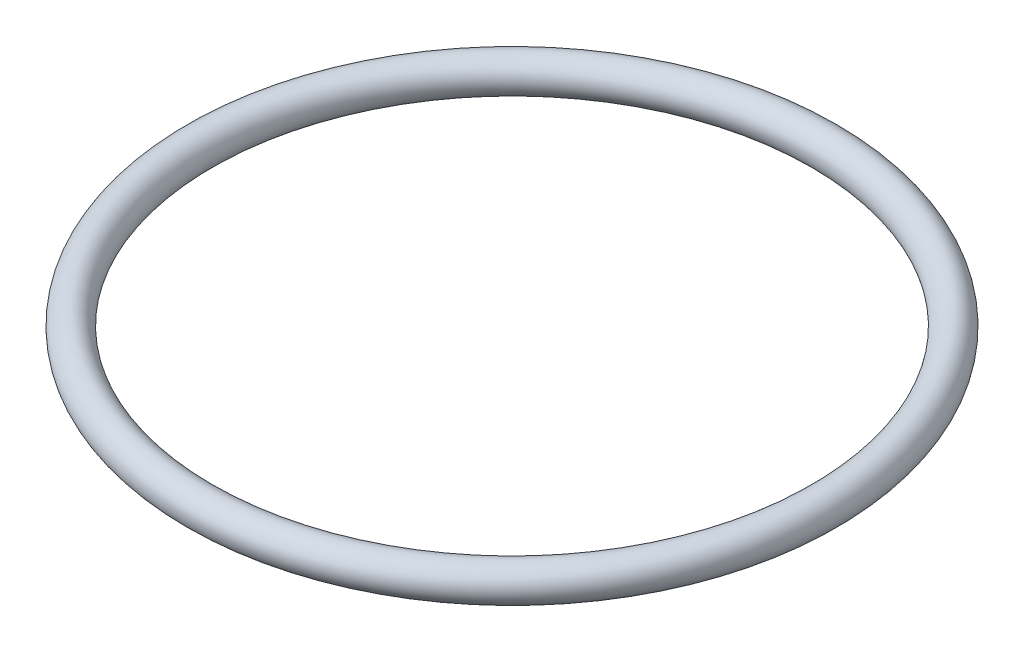
ISO-10303-21;
HEADER;
FILE_DESCRIPTION(('STEP AP214'),'2;1');
FILE_NAME('part.step','',(''),(''),'','','');
FILE_SCHEMA(('AUTOMOTIVE_DESIGN { 1 0 10303 214 1 1 1 1 }'));
ENDSEC;
DATA;
#1=APPLICATION_CONTEXT('core data for automotive mechanical design processes');
#2=APPLICATION_PROTOCOL_DEFINITION('international standard','automotive_design',2000,#1);
#3=PRODUCT_CONTEXT('',#1,'mechanical');
#4=PRODUCT('Part','Part','',(#3));
#5=PRODUCT_RELATED_PRODUCT_CATEGORY('part','',(#4));
#6=PRODUCT_DEFINITION_FORMATION('','',#4);
#7=PRODUCT_DEFINITION_CONTEXT('part definition',#1,'design');
#8=PRODUCT_DEFINITION('design','',#6,#7);
#9=PRODUCT_DEFINITION_SHAPE('','',#8);
#10=(LENGTH_UNIT() NAMED_UNIT(*) SI_UNIT(.MILLI.,.METRE.));
#11=(NAMED_UNIT(*) PLANE_ANGLE_UNIT() SI_UNIT($,.RADIAN.));
#12=(NAMED_UNIT(*) SI_UNIT($,.STERADIAN.) SOLID_ANGLE_UNIT());
#13=UNCERTAINTY_MEASURE_WITH_UNIT(LENGTH_MEASURE(1.E-05),#10,'distance_accuracy_value','');
#14=(GEOMETRIC_REPRESENTATION_CONTEXT(3) GLOBAL_UNCERTAINTY_ASSIGNED_CONTEXT((#13)) GLOBAL_UNIT_ASSIGNED_CONTEXT((#10,
#11,#12)) REPRESENTATION_CONTEXT('',''));
#15=CARTESIAN_POINT('',(0.,0.,0.));
#16=DIRECTION('',(0.,0.,1.));
#17=DIRECTION('',(1.,0.,0.));
#18=AXIS2_PLACEMENT_3D('',#15,#16,#17);
#19=CARTESIAN_POINT('',(0.,0.,0.));
#20=DIRECTION('',(0.,-1.,0.));
#21=DIRECTION('',(0.,0.,-1.));
#22=AXIS2_PLACEMENT_3D('',#19,#20,#21);
#23=TOROIDAL_SURFACE('',#22,22.25,1.25);
#24=CARTESIAN_POINT('',(0.,0.,-23.5));
#25=VERTEX_POINT('',#24);
#26=VERTEX_LOOP('',#25);
#27=FACE_BOUND('',#26,.T.);
#28=ADVANCED_FACE('F31',(#27),#23,.T.);
#29=CLOSED_SHELL('',(#28));
#30=MANIFOLD_SOLID_BREP('B2',#29);
#31=ADVANCED_BREP_SHAPE_REPRESENTATION('',(#18,#30),#14);
#32=SHAPE_DEFINITION_REPRESENTATION(#9,#31);
ENDSEC;
END-ISO-10303-21;
